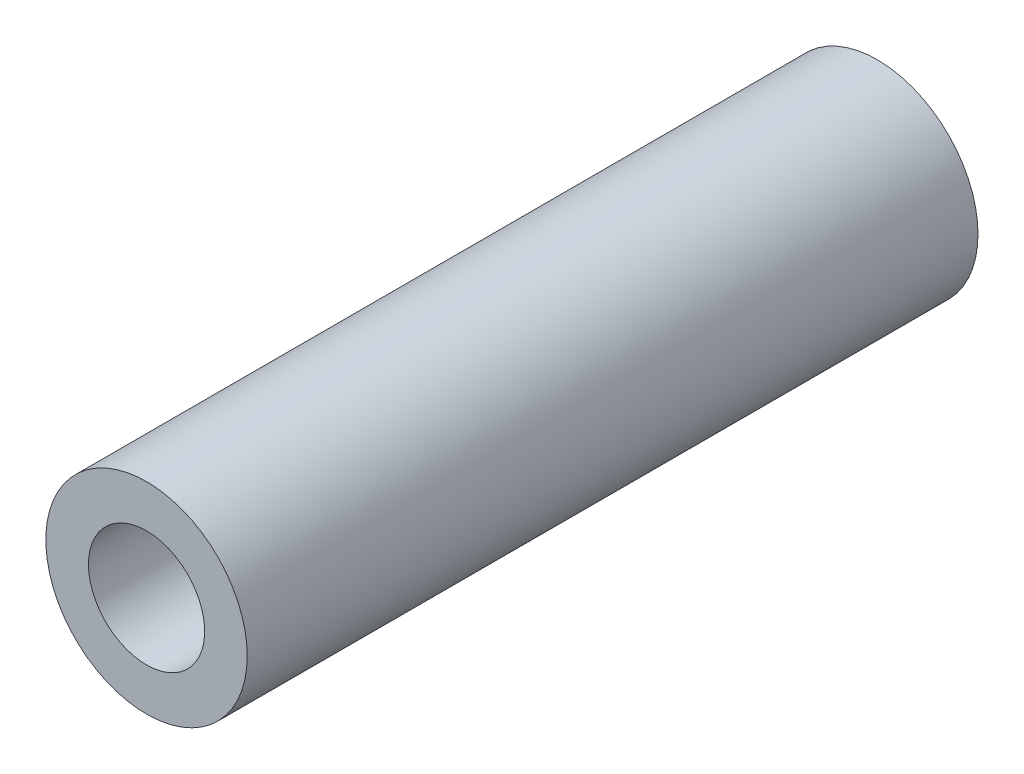
ISO-10303-21;
HEADER;
FILE_DESCRIPTION(('STEP AP214'),'2;1');
FILE_NAME('part.step','',(''),(''),'','','');
FILE_SCHEMA(('AUTOMOTIVE_DESIGN { 1 0 10303 214 1 1 1 1 }'));
ENDSEC;
DATA;
#1=APPLICATION_CONTEXT('core data for automotive mechanical design processes');
#2=APPLICATION_PROTOCOL_DEFINITION('international standard','automotive_design',2000,#1);
#3=PRODUCT_CONTEXT('',#1,'mechanical');
#4=PRODUCT('Part','Part','',(#3));
#5=PRODUCT_RELATED_PRODUCT_CATEGORY('part','',(#4));
#6=PRODUCT_DEFINITION_FORMATION('','',#4);
#7=PRODUCT_DEFINITION_CONTEXT('part definition',#1,'design');
#8=PRODUCT_DEFINITION('design','',#6,#7);
#9=PRODUCT_DEFINITION_SHAPE('','',#8);
#10=(LENGTH_UNIT() NAMED_UNIT(*) SI_UNIT(.MILLI.,.METRE.));
#11=(NAMED_UNIT(*) PLANE_ANGLE_UNIT() SI_UNIT($,.RADIAN.));
#12=(NAMED_UNIT(*) SI_UNIT($,.STERADIAN.) SOLID_ANGLE_UNIT());
#13=UNCERTAINTY_MEASURE_WITH_UNIT(LENGTH_MEASURE(1.E-05),#10,'distance_accuracy_value','');
#14=(GEOMETRIC_REPRESENTATION_CONTEXT(3) GLOBAL_UNCERTAINTY_ASSIGNED_CONTEXT((#13)) GLOBAL_UNIT_ASSIGNED_CONTEXT((#10,
#11,#12)) REPRESENTATION_CONTEXT('',''));
#15=CARTESIAN_POINT('',(0.,0.,0.));
#16=DIRECTION('',(0.,0.,1.));
#17=DIRECTION('',(1.,0.,0.));
#18=AXIS2_PLACEMENT_3D('',#15,#16,#17);
#19=CARTESIAN_POINT('',(0.,0.,25.4));
#20=DIRECTION('',(0.,0.,-1.));
#21=DIRECTION('',(-1.,0.,0.));
#22=AXIS2_PLACEMENT_3D('',#19,#20,#21);
#23=CYLINDRICAL_SURFACE('',#22,3.5);
#24=CARTESIAN_POINT('',(0.,0.,25.4));
#25=DIRECTION('',(0.,0.,1.));
#26=DIRECTION('',(1.,0.,0.));
#27=AXIS2_PLACEMENT_3D('',#24,#25,#26);
#28=CIRCLE('',#27,3.5);
#29=CARTESIAN_POINT('',(3.5,0.,25.4));
#30=VERTEX_POINT('',#29);
#31=EDGE_CURVE('E10',#30,#30,#28,.T.);
#32=ORIENTED_EDGE('',*,*,#31,.F.);
#33=EDGE_LOOP('',(#32));
#34=FACE_BOUND('',#33,.T.);
#35=CARTESIAN_POINT('',(0.,0.,0.));
#36=DIRECTION('',(0.,0.,1.));
#37=DIRECTION('',(1.,0.,0.));
#38=AXIS2_PLACEMENT_3D('',#35,#36,#37);
#39=CIRCLE('',#38,3.5);
#40=CARTESIAN_POINT('',(3.5,0.,0.));
#41=VERTEX_POINT('',#40);
#42=EDGE_CURVE('E23',#41,#41,#39,.T.);
#43=ORIENTED_EDGE('',*,*,#42,.T.);
#44=EDGE_LOOP('',(#43));
#45=FACE_BOUND('',#44,.T.);
#46=ADVANCED_FACE('F15',(#34,#45),#23,.T.);
#47=CARTESIAN_POINT('',(0.,0.,25.4));
#48=DIRECTION('',(0.,0.,1.));
#49=DIRECTION('',(1.,0.,0.));
#50=AXIS2_PLACEMENT_3D('',#47,#48,#49);
#51=PLANE('',#50);
#52=CARTESIAN_POINT('',(0.,0.,25.4));
#53=DIRECTION('',(0.,0.,-1.));
#54=DIRECTION('',(-1.,0.,0.));
#55=AXIS2_PLACEMENT_3D('',#52,#53,#54);
#56=CIRCLE('',#55,2.0193);
#57=CARTESIAN_POINT('',(-2.0193,0.,25.4));
#58=VERTEX_POINT('',#57);
#59=EDGE_CURVE('E32',#58,#58,#56,.T.);
#60=ORIENTED_EDGE('',*,*,#59,.T.);
#61=EDGE_LOOP('',(#60));
#62=FACE_BOUND('',#61,.T.);
#63=ORIENTED_EDGE('',*,*,#31,.T.);
#64=EDGE_LOOP('',(#63));
#65=FACE_BOUND('',#64,.T.);
#66=ADVANCED_FACE('F45',(#62,#65),#51,.T.);
#67=CARTESIAN_POINT('',(0.,0.,0.));
#68=DIRECTION('',(0.,0.,1.));
#69=DIRECTION('',(1.,0.,0.));
#70=AXIS2_PLACEMENT_3D('',#67,#68,#69);
#71=PLANE('',#70);
#72=CARTESIAN_POINT('',(0.,0.,0.));
#73=DIRECTION('',(0.,0.,1.));
#74=DIRECTION('',(1.,0.,0.));
#75=AXIS2_PLACEMENT_3D('',#72,#73,#74);
#76=CIRCLE('',#75,2.0193);
#77=CARTESIAN_POINT('',(2.0193,0.,0.));
#78=VERTEX_POINT('',#77);
#79=EDGE_CURVE('E18',#78,#78,#76,.F.);
#80=ORIENTED_EDGE('',*,*,#79,.F.);
#81=EDGE_LOOP('',(#80));
#82=FACE_BOUND('',#81,.T.);
#83=ORIENTED_EDGE('',*,*,#42,.F.);
#84=EDGE_LOOP('',(#83));
#85=FACE_BOUND('',#84,.T.);
#86=ADVANCED_FACE('F42',(#82,#85),#71,.F.);
#87=CARTESIAN_POINT('',(0.,0.,25.4));
#88=DIRECTION('',(0.,0.,-1.));
#89=DIRECTION('',(-1.,0.,0.));
#90=AXIS2_PLACEMENT_3D('',#87,#88,#89);
#91=CYLINDRICAL_SURFACE('',#90,2.0193);
#92=ORIENTED_EDGE('',*,*,#59,.F.);
#93=EDGE_LOOP('',(#92));
#94=FACE_BOUND('',#93,.T.);
#95=ORIENTED_EDGE('',*,*,#79,.T.);
#96=EDGE_LOOP('',(#95));
#97=FACE_BOUND('',#96,.T.);
#98=ADVANCED_FACE('F40',(#94,#97),#91,.F.);
#99=CLOSED_SHELL('',(#46,#66,#86,#98));
#100=MANIFOLD_SOLID_BREP('B1',#99);
#101=ADVANCED_BREP_SHAPE_REPRESENTATION('',(#18,#100),#14);
#102=SHAPE_DEFINITION_REPRESENTATION(#9,#101);
ENDSEC;
END-ISO-10303-21;
